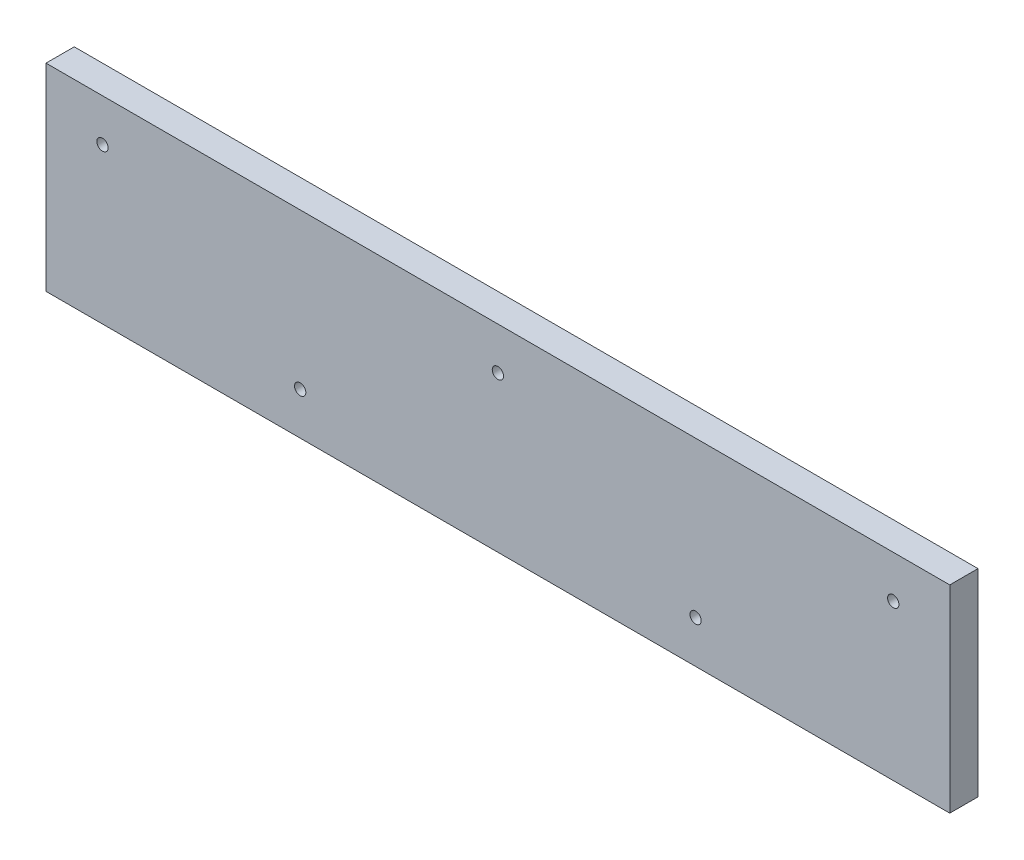
ISO-10303-21;
HEADER;
FILE_DESCRIPTION(('STEP AP214'),'2;1');
FILE_NAME('part.step','',(''),(''),'','','');
FILE_SCHEMA(('AUTOMOTIVE_DESIGN { 1 0 10303 214 1 1 1 1 }'));
ENDSEC;
DATA;
#1=APPLICATION_CONTEXT('core data for automotive mechanical design processes');
#2=APPLICATION_PROTOCOL_DEFINITION('international standard','automotive_design',2000,#1);
#3=PRODUCT_CONTEXT('',#1,'mechanical');
#4=PRODUCT('Part','Part','',(#3));
#5=PRODUCT_RELATED_PRODUCT_CATEGORY('part','',(#4));
#6=PRODUCT_DEFINITION_FORMATION('','',#4);
#7=PRODUCT_DEFINITION_CONTEXT('part definition',#1,'design');
#8=PRODUCT_DEFINITION('design','',#6,#7);
#9=PRODUCT_DEFINITION_SHAPE('','',#8);
#10=(LENGTH_UNIT() NAMED_UNIT(*) SI_UNIT(.MILLI.,.METRE.));
#11=(NAMED_UNIT(*) PLANE_ANGLE_UNIT() SI_UNIT($,.RADIAN.));
#12=(NAMED_UNIT(*) SI_UNIT($,.STERADIAN.) SOLID_ANGLE_UNIT());
#13=UNCERTAINTY_MEASURE_WITH_UNIT(LENGTH_MEASURE(1.E-05),#10,'distance_accuracy_value','');
#14=(GEOMETRIC_REPRESENTATION_CONTEXT(3) GLOBAL_UNCERTAINTY_ASSIGNED_CONTEXT((#13)) GLOBAL_UNIT_ASSIGNED_CONTEXT((#10,
#11,#12)) REPRESENTATION_CONTEXT('',''));
#15=CARTESIAN_POINT('',(0.,0.,0.));
#16=DIRECTION('',(0.,0.,1.));
#17=DIRECTION('',(1.,0.,0.));
#18=AXIS2_PLACEMENT_3D('',#15,#16,#17);
#19=CARTESIAN_POINT('',(0.,0.,10.));
#20=DIRECTION('',(1.,0.,0.));
#21=DIRECTION('',(0.,0.,-1.));
#22=AXIS2_PLACEMENT_3D('',#19,#20,#21);
#23=PLANE('',#22);
#24=DIRECTION('',(0.,-1.,0.));
#25=VECTOR('',#24,1.);
#26=CARTESIAN_POINT('',(0.,0.,0.));
#27=LINE('',#26,#25);
#28=CARTESIAN_POINT('',(0.,70.,0.));
#29=VERTEX_POINT('',#28);
#30=CARTESIAN_POINT('',(0.,0.,0.));
#31=VERTEX_POINT('',#30);
#32=EDGE_CURVE('E96',#29,#31,#27,.T.);
#33=ORIENTED_EDGE('',*,*,#32,.T.);
#34=DIRECTION('',(0.,0.,-1.));
#35=VECTOR('',#34,1.);
#36=CARTESIAN_POINT('',(0.,0.,10.));
#37=LINE('',#36,#35);
#38=CARTESIAN_POINT('',(0.,0.,10.));
#39=VERTEX_POINT('',#38);
#40=EDGE_CURVE('E11',#39,#31,#37,.T.);
#41=ORIENTED_EDGE('',*,*,#40,.F.);
#42=DIRECTION('',(0.,-1.,0.));
#43=VECTOR('',#42,1.);
#44=CARTESIAN_POINT('',(0.,0.,10.));
#45=LINE('',#44,#43);
#46=CARTESIAN_POINT('',(0.,70.,10.));
#47=VERTEX_POINT('',#46);
#48=EDGE_CURVE('E84',#47,#39,#45,.T.);
#49=ORIENTED_EDGE('',*,*,#48,.F.);
#50=DIRECTION('',(0.,0.,-1.));
#51=VECTOR('',#50,1.);
#52=CARTESIAN_POINT('',(0.,70.,10.));
#53=LINE('',#52,#51);
#54=EDGE_CURVE('E92',#47,#29,#53,.T.);
#55=ORIENTED_EDGE('',*,*,#54,.T.);
#56=EDGE_LOOP('',(#33,#41,#49,#55));
#57=FACE_BOUND('',#56,.T.);
#58=ADVANCED_FACE('F33',(#57),#23,.F.);
#59=CARTESIAN_POINT('',(0.,0.,10.));
#60=DIRECTION('',(0.,1.,0.));
#61=DIRECTION('',(0.,0.,1.));
#62=AXIS2_PLACEMENT_3D('',#59,#60,#61);
#63=PLANE('',#62);
#64=DIRECTION('',(1.,0.,0.));
#65=VECTOR('',#64,1.);
#66=CARTESIAN_POINT('',(0.,0.,0.));
#67=LINE('',#66,#65);
#68=CARTESIAN_POINT('',(320.,0.,0.));
#69=VERTEX_POINT('',#68);
#70=EDGE_CURVE('E88',#31,#69,#67,.T.);
#71=ORIENTED_EDGE('',*,*,#70,.T.);
#72=DIRECTION('',(0.,0.,-1.));
#73=VECTOR('',#72,1.);
#74=CARTESIAN_POINT('',(320.,0.,10.));
#75=LINE('',#74,#73);
#76=CARTESIAN_POINT('',(320.,0.,10.));
#77=VERTEX_POINT('',#76);
#78=EDGE_CURVE('E41',#77,#69,#75,.T.);
#79=ORIENTED_EDGE('',*,*,#78,.F.);
#80=DIRECTION('',(1.,0.,0.));
#81=VECTOR('',#80,1.);
#82=CARTESIAN_POINT('',(0.,0.,10.));
#83=LINE('',#82,#81);
#84=EDGE_CURVE('E79',#39,#77,#83,.T.);
#85=ORIENTED_EDGE('',*,*,#84,.F.);
#86=ORIENTED_EDGE('',*,*,#40,.T.);
#87=EDGE_LOOP('',(#71,#79,#85,#86));
#88=FACE_BOUND('',#87,.T.);
#89=ADVANCED_FACE('F87',(#88),#63,.F.);
#90=CARTESIAN_POINT('',(320.,0.,10.));
#91=DIRECTION('',(-1.,0.,0.));
#92=DIRECTION('',(0.,0.,1.));
#93=AXIS2_PLACEMENT_3D('',#90,#91,#92);
#94=PLANE('',#93);
#95=DIRECTION('',(0.,1.,0.));
#96=VECTOR('',#95,1.);
#97=CARTESIAN_POINT('',(320.,0.,0.));
#98=LINE('',#97,#96);
#99=CARTESIAN_POINT('',(320.,70.,0.));
#100=VERTEX_POINT('',#99);
#101=EDGE_CURVE('E66',#69,#100,#98,.T.);
#102=ORIENTED_EDGE('',*,*,#101,.T.);
#103=DIRECTION('',(0.,0.,-1.));
#104=VECTOR('',#103,1.);
#105=CARTESIAN_POINT('',(320.,70.,10.));
#106=LINE('',#105,#104);
#107=CARTESIAN_POINT('',(320.,70.,10.));
#108=VERTEX_POINT('',#107);
#109=EDGE_CURVE('E89',#108,#100,#106,.T.);
#110=ORIENTED_EDGE('',*,*,#109,.F.);
#111=DIRECTION('',(0.,1.,0.));
#112=VECTOR('',#111,1.);
#113=CARTESIAN_POINT('',(320.,0.,10.));
#114=LINE('',#113,#112);
#115=EDGE_CURVE('E82',#77,#108,#114,.T.);
#116=ORIENTED_EDGE('',*,*,#115,.F.);
#117=ORIENTED_EDGE('',*,*,#78,.T.);
#118=EDGE_LOOP('',(#102,#110,#116,#117));
#119=FACE_BOUND('',#118,.T.);
#120=ADVANCED_FACE('F90',(#119),#94,.F.);
#121=CARTESIAN_POINT('',(0.,70.,10.));
#122=DIRECTION('',(0.,-1.,0.));
#123=DIRECTION('',(0.,0.,-1.));
#124=AXIS2_PLACEMENT_3D('',#121,#122,#123);
#125=PLANE('',#124);
#126=DIRECTION('',(-1.,0.,0.));
#127=VECTOR('',#126,1.);
#128=CARTESIAN_POINT('',(0.,70.,0.));
#129=LINE('',#128,#127);
#130=EDGE_CURVE('E72',#100,#29,#129,.T.);
#131=ORIENTED_EDGE('',*,*,#130,.T.);
#132=ORIENTED_EDGE('',*,*,#54,.F.);
#133=DIRECTION('',(-1.,0.,0.));
#134=VECTOR('',#133,1.);
#135=CARTESIAN_POINT('',(0.,70.,10.));
#136=LINE('',#135,#134);
#137=EDGE_CURVE('E49',#108,#47,#136,.T.);
#138=ORIENTED_EDGE('',*,*,#137,.F.);
#139=ORIENTED_EDGE('',*,*,#109,.T.);
#140=EDGE_LOOP('',(#131,#132,#138,#139));
#141=FACE_BOUND('',#140,.T.);
#142=ADVANCED_FACE('F104',(#141),#125,.F.);
#143=CARTESIAN_POINT('',(0.,0.,10.));
#144=DIRECTION('',(0.,0.,-1.));
#145=DIRECTION('',(-1.,0.,0.));
#146=AXIS2_PLACEMENT_3D('',#143,#144,#145);
#147=PLANE('',#146);
#148=CARTESIAN_POINT('',(230.,15.,10.));
#149=DIRECTION('',(0.,0.,-1.));
#150=DIRECTION('',(-1.,0.,0.));
#151=AXIS2_PLACEMENT_3D('',#148,#149,#150);
#152=CIRCLE('',#151,2.);
#153=CARTESIAN_POINT('',(228.,15.,10.));
#154=VERTEX_POINT('',#153);
#155=EDGE_CURVE('E99',#154,#154,#152,.T.);
#156=ORIENTED_EDGE('',*,*,#155,.T.);
#157=EDGE_LOOP('',(#156));
#158=FACE_BOUND('',#157,.T.);
#159=CARTESIAN_POINT('',(300.,55.,10.));
#160=DIRECTION('',(0.,0.,-1.));
#161=DIRECTION('',(-1.,0.,0.));
#162=AXIS2_PLACEMENT_3D('',#159,#160,#161);
#163=CIRCLE('',#162,2.);
#164=CARTESIAN_POINT('',(298.,55.,10.));
#165=VERTEX_POINT('',#164);
#166=EDGE_CURVE('E112',#165,#165,#163,.T.);
#167=ORIENTED_EDGE('',*,*,#166,.T.);
#168=EDGE_LOOP('',(#167));
#169=FACE_BOUND('',#168,.T.);
#170=CARTESIAN_POINT('',(20.,55.,10.));
#171=DIRECTION('',(0.,0.,-1.));
#172=DIRECTION('',(-1.,0.,0.));
#173=AXIS2_PLACEMENT_3D('',#170,#171,#172);
#174=CIRCLE('',#173,2.);
#175=CARTESIAN_POINT('',(18.,55.,10.));
#176=VERTEX_POINT('',#175);
#177=EDGE_CURVE('E115',#176,#176,#174,.T.);
#178=ORIENTED_EDGE('',*,*,#177,.T.);
#179=EDGE_LOOP('',(#178));
#180=FACE_BOUND('',#179,.T.);
#181=CARTESIAN_POINT('',(90.,15.,10.));
#182=DIRECTION('',(0.,0.,-1.));
#183=DIRECTION('',(-1.,0.,0.));
#184=AXIS2_PLACEMENT_3D('',#181,#182,#183);
#185=CIRCLE('',#184,2.);
#186=CARTESIAN_POINT('',(88.,15.,10.));
#187=VERTEX_POINT('',#186);
#188=EDGE_CURVE('E118',#187,#187,#185,.T.);
#189=ORIENTED_EDGE('',*,*,#188,.T.);
#190=EDGE_LOOP('',(#189));
#191=FACE_BOUND('',#190,.T.);
#192=CARTESIAN_POINT('',(160.,55.,10.));
#193=DIRECTION('',(0.,0.,-1.));
#194=DIRECTION('',(-1.,0.,0.));
#195=AXIS2_PLACEMENT_3D('',#192,#193,#194);
#196=CIRCLE('',#195,2.);
#197=CARTESIAN_POINT('',(158.,55.,10.));
#198=VERTEX_POINT('',#197);
#199=EDGE_CURVE('E121',#198,#198,#196,.T.);
#200=ORIENTED_EDGE('',*,*,#199,.T.);
#201=EDGE_LOOP('',(#200));
#202=FACE_BOUND('',#201,.T.);
#203=ORIENTED_EDGE('',*,*,#48,.T.);
#204=ORIENTED_EDGE('',*,*,#84,.T.);
#205=ORIENTED_EDGE('',*,*,#115,.T.);
#206=ORIENTED_EDGE('',*,*,#137,.T.);
#207=EDGE_LOOP('',(#203,#204,#205,#206));
#208=FACE_BOUND('',#207,.T.);
#209=ADVANCED_FACE('F80',(#158,#169,#180,#191,#202,#208),#147,.F.);
#210=CARTESIAN_POINT('',(0.,0.,0.));
#211=DIRECTION('',(0.,0.,-1.));
#212=DIRECTION('',(-1.,0.,0.));
#213=AXIS2_PLACEMENT_3D('',#210,#211,#212);
#214=PLANE('',#213);
#215=CARTESIAN_POINT('',(230.,15.,0.));
#216=DIRECTION('',(0.,0.,1.));
#217=DIRECTION('',(-1.,0.,0.));
#218=AXIS2_PLACEMENT_3D('',#215,#216,#217);
#219=CIRCLE('',#218,2.);
#220=CARTESIAN_POINT('',(228.,15.,0.));
#221=VERTEX_POINT('',#220);
#222=EDGE_CURVE('E128',#221,#221,#219,.T.);
#223=ORIENTED_EDGE('',*,*,#222,.T.);
#224=EDGE_LOOP('',(#223));
#225=FACE_BOUND('',#224,.T.);
#226=CARTESIAN_POINT('',(300.,55.,0.));
#227=DIRECTION('',(0.,0.,1.));
#228=DIRECTION('',(-1.,0.,0.));
#229=AXIS2_PLACEMENT_3D('',#226,#227,#228);
#230=CIRCLE('',#229,2.);
#231=CARTESIAN_POINT('',(298.,55.,0.));
#232=VERTEX_POINT('',#231);
#233=EDGE_CURVE('E131',#232,#232,#230,.T.);
#234=ORIENTED_EDGE('',*,*,#233,.T.);
#235=EDGE_LOOP('',(#234));
#236=FACE_BOUND('',#235,.T.);
#237=CARTESIAN_POINT('',(20.,55.,0.));
#238=DIRECTION('',(0.,0.,1.));
#239=DIRECTION('',(1.,0.,0.));
#240=AXIS2_PLACEMENT_3D('',#237,#238,#239);
#241=CIRCLE('',#240,2.);
#242=CARTESIAN_POINT('',(22.,55.,0.));
#243=VERTEX_POINT('',#242);
#244=EDGE_CURVE('E134',#243,#243,#241,.T.);
#245=ORIENTED_EDGE('',*,*,#244,.T.);
#246=EDGE_LOOP('',(#245));
#247=FACE_BOUND('',#246,.T.);
#248=CARTESIAN_POINT('',(90.,15.,0.));
#249=DIRECTION('',(0.,0.,1.));
#250=DIRECTION('',(1.,0.,0.));
#251=AXIS2_PLACEMENT_3D('',#248,#249,#250);
#252=CIRCLE('',#251,2.);
#253=CARTESIAN_POINT('',(92.,15.,0.));
#254=VERTEX_POINT('',#253);
#255=EDGE_CURVE('E127',#254,#254,#252,.T.);
#256=ORIENTED_EDGE('',*,*,#255,.T.);
#257=EDGE_LOOP('',(#256));
#258=FACE_BOUND('',#257,.T.);
#259=CARTESIAN_POINT('',(160.,55.,0.));
#260=DIRECTION('',(0.,0.,1.));
#261=DIRECTION('',(1.,0.,0.));
#262=AXIS2_PLACEMENT_3D('',#259,#260,#261);
#263=CIRCLE('',#262,2.);
#264=CARTESIAN_POINT('',(162.,55.,0.));
#265=VERTEX_POINT('',#264);
#266=EDGE_CURVE('E124',#265,#265,#263,.T.);
#267=ORIENTED_EDGE('',*,*,#266,.T.);
#268=EDGE_LOOP('',(#267));
#269=FACE_BOUND('',#268,.T.);
#270=ORIENTED_EDGE('',*,*,#32,.F.);
#271=ORIENTED_EDGE('',*,*,#130,.F.);
#272=ORIENTED_EDGE('',*,*,#101,.F.);
#273=ORIENTED_EDGE('',*,*,#70,.F.);
#274=EDGE_LOOP('',(#270,#271,#272,#273));
#275=FACE_BOUND('',#274,.T.);
#276=ADVANCED_FACE('F107',(#225,#236,#247,#258,#269,#275),#214,.T.);
#277=CARTESIAN_POINT('',(160.,55.,0.));
#278=DIRECTION('',(0.,0.,1.));
#279=DIRECTION('',(1.,0.,0.));
#280=AXIS2_PLACEMENT_3D('',#277,#278,#279);
#281=CYLINDRICAL_SURFACE('',#280,2.);
#282=ORIENTED_EDGE('',*,*,#266,.F.);
#283=EDGE_LOOP('',(#282));
#284=FACE_BOUND('',#283,.T.);
#285=ORIENTED_EDGE('',*,*,#199,.F.);
#286=EDGE_LOOP('',(#285));
#287=FACE_BOUND('',#286,.T.);
#288=ADVANCED_FACE('F146',(#284,#287),#281,.F.);
#289=CARTESIAN_POINT('',(90.,15.,0.));
#290=DIRECTION('',(0.,0.,1.));
#291=DIRECTION('',(1.,0.,0.));
#292=AXIS2_PLACEMENT_3D('',#289,#290,#291);
#293=CYLINDRICAL_SURFACE('',#292,2.);
#294=ORIENTED_EDGE('',*,*,#255,.F.);
#295=EDGE_LOOP('',(#294));
#296=FACE_BOUND('',#295,.T.);
#297=ORIENTED_EDGE('',*,*,#188,.F.);
#298=EDGE_LOOP('',(#297));
#299=FACE_BOUND('',#298,.T.);
#300=ADVANCED_FACE('F142',(#296,#299),#293,.F.);
#301=CARTESIAN_POINT('',(20.,55.,0.));
#302=DIRECTION('',(0.,0.,1.));
#303=DIRECTION('',(1.,0.,0.));
#304=AXIS2_PLACEMENT_3D('',#301,#302,#303);
#305=CYLINDRICAL_SURFACE('',#304,2.);
#306=ORIENTED_EDGE('',*,*,#244,.F.);
#307=EDGE_LOOP('',(#306));
#308=FACE_BOUND('',#307,.T.);
#309=ORIENTED_EDGE('',*,*,#177,.F.);
#310=EDGE_LOOP('',(#309));
#311=FACE_BOUND('',#310,.T.);
#312=ADVANCED_FACE('F145',(#308,#311),#305,.F.);
#313=CARTESIAN_POINT('',(300.,55.,0.));
#314=DIRECTION('',(0.,0.,1.));
#315=DIRECTION('',(1.,0.,0.));
#316=AXIS2_PLACEMENT_3D('',#313,#314,#315);
#317=CYLINDRICAL_SURFACE('',#316,2.);
#318=ORIENTED_EDGE('',*,*,#233,.F.);
#319=EDGE_LOOP('',(#318));
#320=FACE_BOUND('',#319,.T.);
#321=ORIENTED_EDGE('',*,*,#166,.F.);
#322=EDGE_LOOP('',(#321));
#323=FACE_BOUND('',#322,.T.);
#324=ADVANCED_FACE('F207',(#320,#323),#317,.F.);
#325=CARTESIAN_POINT('',(230.,15.,0.));
#326=DIRECTION('',(0.,0.,1.));
#327=DIRECTION('',(1.,0.,0.));
#328=AXIS2_PLACEMENT_3D('',#325,#326,#327);
#329=CYLINDRICAL_SURFACE('',#328,2.);
#330=ORIENTED_EDGE('',*,*,#222,.F.);
#331=EDGE_LOOP('',(#330));
#332=FACE_BOUND('',#331,.T.);
#333=ORIENTED_EDGE('',*,*,#155,.F.);
#334=EDGE_LOOP('',(#333));
#335=FACE_BOUND('',#334,.T.);
#336=ADVANCED_FACE('F217',(#332,#335),#329,.F.);
#337=CLOSED_SHELL('',(#58,#89,#120,#142,#209,#276,#288,#300,#312,#324,#336));
#338=MANIFOLD_SOLID_BREP('B2',#337);
#339=ADVANCED_BREP_SHAPE_REPRESENTATION('',(#18,#338),#14);
#340=SHAPE_DEFINITION_REPRESENTATION(#9,#339);
ENDSEC;
END-ISO-10303-21;
